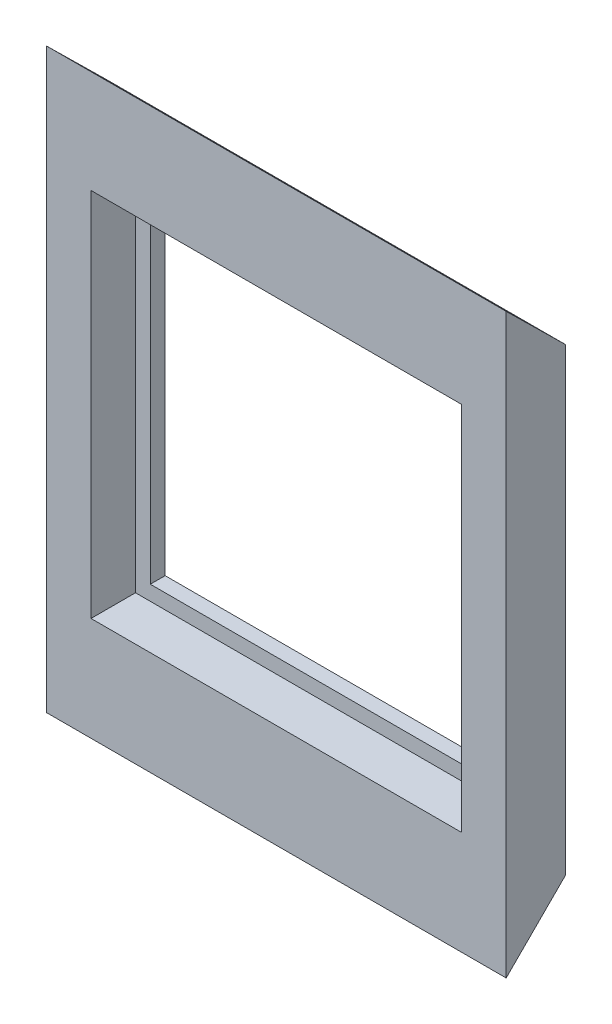
ISO-10303-21;
HEADER;
FILE_DESCRIPTION(('STEP AP214'),'2;1');
FILE_NAME('part.step','',(''),(''),'','','');
FILE_SCHEMA(('AUTOMOTIVE_DESIGN { 1 0 10303 214 1 1 1 1 }'));
ENDSEC;
DATA;
#1=APPLICATION_CONTEXT('core data for automotive mechanical design processes');
#2=APPLICATION_PROTOCOL_DEFINITION('international standard','automotive_design',2000,#1);
#3=PRODUCT_CONTEXT('',#1,'mechanical');
#4=PRODUCT('Part','Part','',(#3));
#5=PRODUCT_RELATED_PRODUCT_CATEGORY('part','',(#4));
#6=PRODUCT_DEFINITION_FORMATION('','',#4);
#7=PRODUCT_DEFINITION_CONTEXT('part definition',#1,'design');
#8=PRODUCT_DEFINITION('design','',#6,#7);
#9=PRODUCT_DEFINITION_SHAPE('','',#8);
#10=(LENGTH_UNIT() NAMED_UNIT(*) SI_UNIT(.MILLI.,.METRE.));
#11=(NAMED_UNIT(*) PLANE_ANGLE_UNIT() SI_UNIT($,.RADIAN.));
#12=(NAMED_UNIT(*) SI_UNIT($,.STERADIAN.) SOLID_ANGLE_UNIT());
#13=UNCERTAINTY_MEASURE_WITH_UNIT(LENGTH_MEASURE(1.E-05),#10,'distance_accuracy_value','');
#14=(GEOMETRIC_REPRESENTATION_CONTEXT(3) GLOBAL_UNCERTAINTY_ASSIGNED_CONTEXT((#13)) GLOBAL_UNIT_ASSIGNED_CONTEXT((#10,
#11,#12)) REPRESENTATION_CONTEXT('',''));
#15=CARTESIAN_POINT('',(0.,0.,0.));
#16=DIRECTION('',(0.,0.,1.));
#17=DIRECTION('',(1.,0.,0.));
#18=AXIS2_PLACEMENT_3D('',#15,#16,#17);
#19=CARTESIAN_POINT('',(0.,0.,1.));
#20=DIRECTION('',(0.,0.,-1.));
#21=DIRECTION('',(-1.,0.,0.));
#22=AXIS2_PLACEMENT_3D('',#19,#20,#21);
#23=PLANE('',#22);
#24=DIRECTION('',(0.,1.,0.));
#25=VECTOR('',#24,1.);
#26=CARTESIAN_POINT('',(12.5,-12.5,1.));
#27=LINE('',#26,#25);
#28=CARTESIAN_POINT('',(12.5,-12.5,1.));
#29=VERTEX_POINT('',#28);
#30=CARTESIAN_POINT('',(12.5,12.5,1.));
#31=VERTEX_POINT('',#30);
#32=EDGE_CURVE('E178',#29,#31,#27,.T.);
#33=ORIENTED_EDGE('',*,*,#32,.T.);
#34=DIRECTION('',(-1.,0.,0.));
#35=VECTOR('',#34,1.);
#36=CARTESIAN_POINT('',(-12.5,12.5,1.));
#37=LINE('',#36,#35);
#38=CARTESIAN_POINT('',(-12.5,12.5,1.));
#39=VERTEX_POINT('',#38);
#40=EDGE_CURVE('E181',#31,#39,#37,.T.);
#41=ORIENTED_EDGE('',*,*,#40,.T.);
#42=DIRECTION('',(0.,-1.,0.));
#43=VECTOR('',#42,1.);
#44=CARTESIAN_POINT('',(-12.5,-12.5,1.));
#45=LINE('',#44,#43);
#46=CARTESIAN_POINT('',(-12.5,-12.5,1.));
#47=VERTEX_POINT('',#46);
#48=EDGE_CURVE('E185',#39,#47,#45,.T.);
#49=ORIENTED_EDGE('',*,*,#48,.T.);
#50=DIRECTION('',(1.,0.,0.));
#51=VECTOR('',#50,1.);
#52=CARTESIAN_POINT('',(-12.5,-12.5,1.));
#53=LINE('',#52,#51);
#54=EDGE_CURVE('E188',#47,#29,#53,.T.);
#55=ORIENTED_EDGE('',*,*,#54,.T.);
#56=EDGE_LOOP('',(#33,#41,#49,#55));
#57=FACE_BOUND('',#56,.T.);
#58=DIRECTION('',(0.,1.,0.));
#59=VECTOR('',#58,1.);
#60=CARTESIAN_POINT('',(11.5,-11.5,1.));
#61=LINE('',#60,#59);
#62=CARTESIAN_POINT('',(11.5,-11.5,1.));
#63=VERTEX_POINT('',#62);
#64=CARTESIAN_POINT('',(11.5,11.5,1.));
#65=VERTEX_POINT('',#64);
#66=EDGE_CURVE('E161',#63,#65,#61,.T.);
#67=ORIENTED_EDGE('',*,*,#66,.F.);
#68=DIRECTION('',(1.,0.,0.));
#69=VECTOR('',#68,1.);
#70=CARTESIAN_POINT('',(-11.5,-11.5,1.));
#71=LINE('',#70,#69);
#72=CARTESIAN_POINT('',(-11.5,-11.5,1.));
#73=VERTEX_POINT('',#72);
#74=EDGE_CURVE('E167',#73,#63,#71,.T.);
#75=ORIENTED_EDGE('',*,*,#74,.F.);
#76=DIRECTION('',(0.,-1.,0.));
#77=VECTOR('',#76,1.);
#78=CARTESIAN_POINT('',(-11.5,-11.5,1.));
#79=LINE('',#78,#77);
#80=CARTESIAN_POINT('',(-11.5,11.5,1.));
#81=VERTEX_POINT('',#80);
#82=EDGE_CURVE('E54',#81,#73,#79,.T.);
#83=ORIENTED_EDGE('',*,*,#82,.F.);
#84=DIRECTION('',(-1.,0.,0.));
#85=VECTOR('',#84,1.);
#86=CARTESIAN_POINT('',(-11.5,11.5,1.));
#87=LINE('',#86,#85);
#88=EDGE_CURVE('E164',#65,#81,#87,.T.);
#89=ORIENTED_EDGE('',*,*,#88,.F.);
#90=EDGE_LOOP('',(#67,#75,#83,#89));
#91=FACE_BOUND('',#90,.T.);
#92=ADVANCED_FACE('F39',(#57,#91),#23,.F.);
#93=CARTESIAN_POINT('',(15.5,-15.5,4.));
#94=DIRECTION('',(-1.,0.,0.));
#95=DIRECTION('',(0.,0.,1.));
#96=AXIS2_PLACEMENT_3D('',#93,#94,#95);
#97=PLANE('',#96);
#98=DIRECTION('',(0.,1.,0.));
#99=VECTOR('',#98,1.);
#100=CARTESIAN_POINT('',(15.5,-15.5,0.));
#101=LINE('',#100,#99);
#102=CARTESIAN_POINT('',(15.5,-15.5,0.));
#103=VERTEX_POINT('',#102);
#104=CARTESIAN_POINT('',(15.5,15.5,0.));
#105=VERTEX_POINT('',#104);
#106=EDGE_CURVE('E143',#103,#105,#101,.T.);
#107=ORIENTED_EDGE('',*,*,#106,.T.);
#108=DIRECTION('',(0.,-0.701412928033966,-0.712755150375511));
#109=VECTOR('',#108,1.);
#110=CARTESIAN_POINT('',(15.5,15.5,0.));
#111=LINE('',#110,#109);
#112=CARTESIAN_POINT('',(15.5,19.4363471602523,4.));
#113=VERTEX_POINT('',#112);
#114=EDGE_CURVE('E142',#113,#105,#111,.T.);
#115=ORIENTED_EDGE('',*,*,#114,.F.);
#116=DIRECTION('',(0.,1.,0.));
#117=VECTOR('',#116,1.);
#118=CARTESIAN_POINT('',(15.5,-15.5,4.));
#119=LINE('',#118,#117);
#120=CARTESIAN_POINT('',(15.5,-19.5,4.));
#121=VERTEX_POINT('',#120);
#122=EDGE_CURVE('E128',#121,#113,#119,.T.);
#123=ORIENTED_EDGE('',*,*,#122,.F.);
#124=DIRECTION('',(0.,-0.707106781186549,0.707106781186546));
#125=VECTOR('',#124,1.);
#126=CARTESIAN_POINT('',(15.5,-19.5,4.));
#127=LINE('',#126,#125);
#128=EDGE_CURVE('E157',#103,#121,#127,.T.);
#129=ORIENTED_EDGE('',*,*,#128,.F.);
#130=EDGE_LOOP('',(#107,#115,#123,#129));
#131=FACE_BOUND('',#130,.T.);
#132=ADVANCED_FACE('F41',(#131),#97,.F.);
#133=CARTESIAN_POINT('',(-15.5,-15.5,4.));
#134=DIRECTION('',(1.,0.,0.));
#135=DIRECTION('',(0.,0.,-1.));
#136=AXIS2_PLACEMENT_3D('',#133,#134,#135);
#137=PLANE('',#136);
#138=DIRECTION('',(0.,-1.,0.));
#139=VECTOR('',#138,1.);
#140=CARTESIAN_POINT('',(-15.5,-15.5,0.));
#141=LINE('',#140,#139);
#142=CARTESIAN_POINT('',(-15.5,15.5,0.));
#143=VERTEX_POINT('',#142);
#144=CARTESIAN_POINT('',(-15.5,-15.5,0.));
#145=VERTEX_POINT('',#144);
#146=EDGE_CURVE('E214',#143,#145,#141,.T.);
#147=ORIENTED_EDGE('',*,*,#146,.T.);
#148=DIRECTION('',(0.,-0.707106781186549,0.707106781186546));
#149=VECTOR('',#148,1.);
#150=CARTESIAN_POINT('',(-15.5,-19.5,4.));
#151=LINE('',#150,#149);
#152=CARTESIAN_POINT('',(-15.5,-19.5,4.));
#153=VERTEX_POINT('',#152);
#154=EDGE_CURVE('E153',#145,#153,#151,.T.);
#155=ORIENTED_EDGE('',*,*,#154,.T.);
#156=DIRECTION('',(0.,-1.,0.));
#157=VECTOR('',#156,1.);
#158=CARTESIAN_POINT('',(-15.5,-15.5,4.));
#159=LINE('',#158,#157);
#160=CARTESIAN_POINT('',(-15.5,19.4363471602523,4.));
#161=VERTEX_POINT('',#160);
#162=EDGE_CURVE('E138',#161,#153,#159,.T.);
#163=ORIENTED_EDGE('',*,*,#162,.F.);
#164=DIRECTION('',(0.,-0.701412928033966,-0.712755150375511));
#165=VECTOR('',#164,1.);
#166=CARTESIAN_POINT('',(-15.5,15.5,0.));
#167=LINE('',#166,#165);
#168=EDGE_CURVE('E151',#161,#143,#167,.T.);
#169=ORIENTED_EDGE('',*,*,#168,.T.);
#170=EDGE_LOOP('',(#147,#155,#163,#169));
#171=FACE_BOUND('',#170,.T.);
#172=ADVANCED_FACE('F247',(#171),#137,.F.);
#173=CARTESIAN_POINT('',(0.,0.,4.));
#174=DIRECTION('',(0.,0.,-1.));
#175=DIRECTION('',(-1.,0.,0.));
#176=AXIS2_PLACEMENT_3D('',#173,#174,#175);
#177=PLANE('',#176);
#178=DIRECTION('',(-1.,0.,0.));
#179=VECTOR('',#178,1.);
#180=CARTESIAN_POINT('',(-12.5,12.5,4.));
#181=LINE('',#180,#179);
#182=CARTESIAN_POINT('',(12.5,12.5,4.));
#183=VERTEX_POINT('',#182);
#184=CARTESIAN_POINT('',(-12.5,12.5,4.));
#185=VERTEX_POINT('',#184);
#186=EDGE_CURVE('E193',#183,#185,#181,.T.);
#187=ORIENTED_EDGE('',*,*,#186,.F.);
#188=DIRECTION('',(0.,1.,0.));
#189=VECTOR('',#188,1.);
#190=CARTESIAN_POINT('',(12.5,-12.5,4.));
#191=LINE('',#190,#189);
#192=CARTESIAN_POINT('',(12.5,-12.5,4.));
#193=VERTEX_POINT('',#192);
#194=EDGE_CURVE('E173',#193,#183,#191,.T.);
#195=ORIENTED_EDGE('',*,*,#194,.F.);
#196=DIRECTION('',(1.,0.,0.));
#197=VECTOR('',#196,1.);
#198=CARTESIAN_POINT('',(-12.5,-12.5,4.));
#199=LINE('',#198,#197);
#200=CARTESIAN_POINT('',(-12.5,-12.5,4.));
#201=VERTEX_POINT('',#200);
#202=EDGE_CURVE('E182',#201,#193,#199,.T.);
#203=ORIENTED_EDGE('',*,*,#202,.F.);
#204=DIRECTION('',(0.,-1.,0.));
#205=VECTOR('',#204,1.);
#206=CARTESIAN_POINT('',(-12.5,-12.5,4.));
#207=LINE('',#206,#205);
#208=EDGE_CURVE('E196',#185,#201,#207,.T.);
#209=ORIENTED_EDGE('',*,*,#208,.F.);
#210=EDGE_LOOP('',(#187,#195,#203,#209));
#211=FACE_BOUND('',#210,.T.);
#212=ORIENTED_EDGE('',*,*,#122,.T.);
#213=DIRECTION('',(-1.,0.,0.));
#214=VECTOR('',#213,1.);
#215=CARTESIAN_POINT('',(15.5,19.4363471602523,4.));
#216=LINE('',#215,#214);
#217=EDGE_CURVE('E132',#113,#161,#216,.T.);
#218=ORIENTED_EDGE('',*,*,#217,.T.);
#219=ORIENTED_EDGE('',*,*,#162,.T.);
#220=DIRECTION('',(1.,0.,0.));
#221=VECTOR('',#220,1.);
#222=CARTESIAN_POINT('',(-15.5,-19.5,4.));
#223=LINE('',#222,#221);
#224=EDGE_CURVE('E134',#153,#121,#223,.T.);
#225=ORIENTED_EDGE('',*,*,#224,.T.);
#226=EDGE_LOOP('',(#212,#218,#219,#225));
#227=FACE_BOUND('',#226,.T.);
#228=ADVANCED_FACE('F130',(#211,#227),#177,.F.);
#229=CARTESIAN_POINT('',(0.,0.,0.));
#230=DIRECTION('',(0.,0.,-1.));
#231=DIRECTION('',(-1.,0.,0.));
#232=AXIS2_PLACEMENT_3D('',#229,#230,#231);
#233=PLANE('',#232);
#234=DIRECTION('',(0.,-1.,0.));
#235=VECTOR('',#234,1.);
#236=CARTESIAN_POINT('',(11.5,0.,0.));
#237=LINE('',#236,#235);
#238=CARTESIAN_POINT('',(11.5,11.5,0.));
#239=VERTEX_POINT('',#238);
#240=CARTESIAN_POINT('',(11.5,-11.5,0.));
#241=VERTEX_POINT('',#240);
#242=EDGE_CURVE('E11',#239,#241,#237,.T.);
#243=ORIENTED_EDGE('',*,*,#242,.F.);
#244=DIRECTION('',(1.,0.,0.));
#245=VECTOR('',#244,1.);
#246=CARTESIAN_POINT('',(0.,11.5,0.));
#247=LINE('',#246,#245);
#248=CARTESIAN_POINT('',(-11.5,11.5,0.));
#249=VERTEX_POINT('',#248);
#250=EDGE_CURVE('E210',#249,#239,#247,.T.);
#251=ORIENTED_EDGE('',*,*,#250,.F.);
#252=DIRECTION('',(0.,1.,0.));
#253=VECTOR('',#252,1.);
#254=CARTESIAN_POINT('',(-11.5,0.,0.));
#255=LINE('',#254,#253);
#256=CARTESIAN_POINT('',(-11.5,-11.5,0.));
#257=VERTEX_POINT('',#256);
#258=EDGE_CURVE('E220',#257,#249,#255,.T.);
#259=ORIENTED_EDGE('',*,*,#258,.F.);
#260=DIRECTION('',(-1.,0.,0.));
#261=VECTOR('',#260,1.);
#262=CARTESIAN_POINT('',(0.,-11.5,0.));
#263=LINE('',#262,#261);
#264=EDGE_CURVE('E47',#241,#257,#263,.T.);
#265=ORIENTED_EDGE('',*,*,#264,.F.);
#266=EDGE_LOOP('',(#243,#251,#259,#265));
#267=FACE_BOUND('',#266,.T.);
#268=ORIENTED_EDGE('',*,*,#106,.F.);
#269=DIRECTION('',(1.,0.,0.));
#270=VECTOR('',#269,1.);
#271=CARTESIAN_POINT('',(-15.5,-15.5,0.));
#272=LINE('',#271,#270);
#273=EDGE_CURVE('E139',#145,#103,#272,.T.);
#274=ORIENTED_EDGE('',*,*,#273,.F.);
#275=ORIENTED_EDGE('',*,*,#146,.F.);
#276=DIRECTION('',(-1.,0.,0.));
#277=VECTOR('',#276,1.);
#278=CARTESIAN_POINT('',(-15.5,15.5,0.));
#279=LINE('',#278,#277);
#280=EDGE_CURVE('E212',#105,#143,#279,.T.);
#281=ORIENTED_EDGE('',*,*,#280,.F.);
#282=EDGE_LOOP('',(#268,#274,#275,#281));
#283=FACE_BOUND('',#282,.T.);
#284=ADVANCED_FACE('F231',(#267,#283),#233,.T.);
#285=CARTESIAN_POINT('',(12.5,-12.5,1.));
#286=DIRECTION('',(1.,0.,0.));
#287=DIRECTION('',(0.,0.,-1.));
#288=AXIS2_PLACEMENT_3D('',#285,#286,#287);
#289=PLANE('',#288);
#290=ORIENTED_EDGE('',*,*,#194,.T.);
#291=DIRECTION('',(0.,0.,1.));
#292=VECTOR('',#291,1.);
#293=CARTESIAN_POINT('',(12.5,12.5,1.));
#294=LINE('',#293,#292);
#295=EDGE_CURVE('E191',#31,#183,#294,.T.);
#296=ORIENTED_EDGE('',*,*,#295,.F.);
#297=ORIENTED_EDGE('',*,*,#32,.F.);
#298=DIRECTION('',(0.,0.,1.));
#299=VECTOR('',#298,1.);
#300=CARTESIAN_POINT('',(12.5,-12.5,1.));
#301=LINE('',#300,#299);
#302=EDGE_CURVE('E201',#29,#193,#301,.T.);
#303=ORIENTED_EDGE('',*,*,#302,.T.);
#304=EDGE_LOOP('',(#290,#296,#297,#303));
#305=FACE_BOUND('',#304,.T.);
#306=ADVANCED_FACE('F255',(#305),#289,.F.);
#307=CARTESIAN_POINT('',(-12.5,-12.5,1.));
#308=DIRECTION('',(0.,-1.,0.));
#309=DIRECTION('',(0.,0.,-1.));
#310=AXIS2_PLACEMENT_3D('',#307,#308,#309);
#311=PLANE('',#310);
#312=ORIENTED_EDGE('',*,*,#202,.T.);
#313=ORIENTED_EDGE('',*,*,#302,.F.);
#314=ORIENTED_EDGE('',*,*,#54,.F.);
#315=DIRECTION('',(0.,0.,1.));
#316=VECTOR('',#315,1.);
#317=CARTESIAN_POINT('',(-12.5,-12.5,1.));
#318=LINE('',#317,#316);
#319=EDGE_CURVE('E203',#47,#201,#318,.T.);
#320=ORIENTED_EDGE('',*,*,#319,.T.);
#321=EDGE_LOOP('',(#312,#313,#314,#320));
#322=FACE_BOUND('',#321,.T.);
#323=ADVANCED_FACE('F251',(#322),#311,.F.);
#324=CARTESIAN_POINT('',(-12.5,-12.5,1.));
#325=DIRECTION('',(-1.,0.,0.));
#326=DIRECTION('',(0.,0.,1.));
#327=AXIS2_PLACEMENT_3D('',#324,#325,#326);
#328=PLANE('',#327);
#329=ORIENTED_EDGE('',*,*,#208,.T.);
#330=ORIENTED_EDGE('',*,*,#319,.F.);
#331=ORIENTED_EDGE('',*,*,#48,.F.);
#332=DIRECTION('',(0.,0.,1.));
#333=VECTOR('',#332,1.);
#334=CARTESIAN_POINT('',(-12.5,12.5,1.));
#335=LINE('',#334,#333);
#336=EDGE_CURVE('E205',#39,#185,#335,.T.);
#337=ORIENTED_EDGE('',*,*,#336,.T.);
#338=EDGE_LOOP('',(#329,#330,#331,#337));
#339=FACE_BOUND('',#338,.T.);
#340=ADVANCED_FACE('F254',(#339),#328,.F.);
#341=CARTESIAN_POINT('',(-12.5,12.5,1.));
#342=DIRECTION('',(0.,1.,0.));
#343=DIRECTION('',(0.,0.,1.));
#344=AXIS2_PLACEMENT_3D('',#341,#342,#343);
#345=PLANE('',#344);
#346=ORIENTED_EDGE('',*,*,#186,.T.);
#347=ORIENTED_EDGE('',*,*,#336,.F.);
#348=ORIENTED_EDGE('',*,*,#40,.F.);
#349=ORIENTED_EDGE('',*,*,#295,.T.);
#350=EDGE_LOOP('',(#346,#347,#348,#349));
#351=FACE_BOUND('',#350,.T.);
#352=ADVANCED_FACE('F259',(#351),#345,.F.);
#353=CARTESIAN_POINT('',(11.5,-11.5,-4.));
#354=DIRECTION('',(1.,0.,0.));
#355=DIRECTION('',(0.,0.,-1.));
#356=AXIS2_PLACEMENT_3D('',#353,#354,#355);
#357=PLANE('',#356);
#358=ORIENTED_EDGE('',*,*,#242,.T.);
#359=DIRECTION('',(0.,0.,1.));
#360=VECTOR('',#359,1.);
#361=CARTESIAN_POINT('',(11.5,-11.5,-4.));
#362=LINE('',#361,#360);
#363=EDGE_CURVE('E171',#241,#63,#362,.T.);
#364=ORIENTED_EDGE('',*,*,#363,.T.);
#365=ORIENTED_EDGE('',*,*,#66,.T.);
#366=DIRECTION('',(0.,0.,1.));
#367=VECTOR('',#366,1.);
#368=CARTESIAN_POINT('',(11.5,11.5,-4.));
#369=LINE('',#368,#367);
#370=EDGE_CURVE('E170',#239,#65,#369,.T.);
#371=ORIENTED_EDGE('',*,*,#370,.F.);
#372=EDGE_LOOP('',(#358,#364,#365,#371));
#373=FACE_BOUND('',#372,.T.);
#374=ADVANCED_FACE('F236',(#373),#357,.F.);
#375=CARTESIAN_POINT('',(-11.5,-11.5,-4.));
#376=DIRECTION('',(0.,-1.,0.));
#377=DIRECTION('',(0.,0.,-1.));
#378=AXIS2_PLACEMENT_3D('',#375,#376,#377);
#379=PLANE('',#378);
#380=ORIENTED_EDGE('',*,*,#264,.T.);
#381=DIRECTION('',(0.,0.,1.));
#382=VECTOR('',#381,1.);
#383=CARTESIAN_POINT('',(-11.5,-11.5,-4.));
#384=LINE('',#383,#382);
#385=EDGE_CURVE('E174',#257,#73,#384,.T.);
#386=ORIENTED_EDGE('',*,*,#385,.T.);
#387=ORIENTED_EDGE('',*,*,#74,.T.);
#388=ORIENTED_EDGE('',*,*,#363,.F.);
#389=EDGE_LOOP('',(#380,#386,#387,#388));
#390=FACE_BOUND('',#389,.T.);
#391=ADVANCED_FACE('F224',(#390),#379,.F.);
#392=CARTESIAN_POINT('',(-11.5,-11.5,-4.));
#393=DIRECTION('',(-1.,0.,0.));
#394=DIRECTION('',(0.,0.,1.));
#395=AXIS2_PLACEMENT_3D('',#392,#393,#394);
#396=PLANE('',#395);
#397=ORIENTED_EDGE('',*,*,#258,.T.);
#398=DIRECTION('',(0.,0.,1.));
#399=VECTOR('',#398,1.);
#400=CARTESIAN_POINT('',(-11.5,11.5,-4.));
#401=LINE('',#400,#399);
#402=EDGE_CURVE('E61',#249,#81,#401,.T.);
#403=ORIENTED_EDGE('',*,*,#402,.T.);
#404=ORIENTED_EDGE('',*,*,#82,.T.);
#405=ORIENTED_EDGE('',*,*,#385,.F.);
#406=EDGE_LOOP('',(#397,#403,#404,#405));
#407=FACE_BOUND('',#406,.T.);
#408=ADVANCED_FACE('F229',(#407),#396,.F.);
#409=CARTESIAN_POINT('',(-11.5,11.5,-4.));
#410=DIRECTION('',(0.,1.,0.));
#411=DIRECTION('',(0.,0.,1.));
#412=AXIS2_PLACEMENT_3D('',#409,#410,#411);
#413=PLANE('',#412);
#414=ORIENTED_EDGE('',*,*,#250,.T.);
#415=ORIENTED_EDGE('',*,*,#370,.T.);
#416=ORIENTED_EDGE('',*,*,#88,.T.);
#417=ORIENTED_EDGE('',*,*,#402,.F.);
#418=EDGE_LOOP('',(#414,#415,#416,#417));
#419=FACE_BOUND('',#418,.T.);
#420=ADVANCED_FACE('F234',(#419),#413,.F.);
#421=CARTESIAN_POINT('',(-15.5,-19.5,4.));
#422=DIRECTION('',(0.,0.707106781186546,0.707106781186549));
#423=DIRECTION('',(0.,-0.707106781186549,0.707106781186546));
#424=AXIS2_PLACEMENT_3D('',#421,#422,#423);
#425=PLANE('',#424);
#426=ORIENTED_EDGE('',*,*,#128,.T.);
#427=ORIENTED_EDGE('',*,*,#224,.F.);
#428=ORIENTED_EDGE('',*,*,#154,.F.);
#429=ORIENTED_EDGE('',*,*,#273,.T.);
#430=EDGE_LOOP('',(#426,#427,#428,#429));
#431=FACE_BOUND('',#430,.T.);
#432=ADVANCED_FACE('F277',(#431),#425,.F.);
#433=CARTESIAN_POINT('',(15.5,15.5,0.));
#434=DIRECTION('',(0.,0.712755150375511,-0.701412928033966));
#435=DIRECTION('',(0.,0.701412928033966,0.712755150375511));
#436=AXIS2_PLACEMENT_3D('',#433,#434,#435);
#437=PLANE('',#436);
#438=ORIENTED_EDGE('',*,*,#280,.T.);
#439=ORIENTED_EDGE('',*,*,#168,.F.);
#440=ORIENTED_EDGE('',*,*,#217,.F.);
#441=ORIENTED_EDGE('',*,*,#114,.T.);
#442=EDGE_LOOP('',(#438,#439,#440,#441));
#443=FACE_BOUND('',#442,.T.);
#444=ADVANCED_FACE('F149',(#443),#437,.T.);
#445=CLOSED_SHELL('',(#92,#132,#172,#228,#284,#306,#323,#340,#352,#374,#391,#408,#420,#432,#444));
#446=MANIFOLD_SOLID_BREP('B2',#445);
#447=ADVANCED_BREP_SHAPE_REPRESENTATION('',(#18,#446),#14);
#448=SHAPE_DEFINITION_REPRESENTATION(#9,#447);
ENDSEC;
END-ISO-10303-21;
